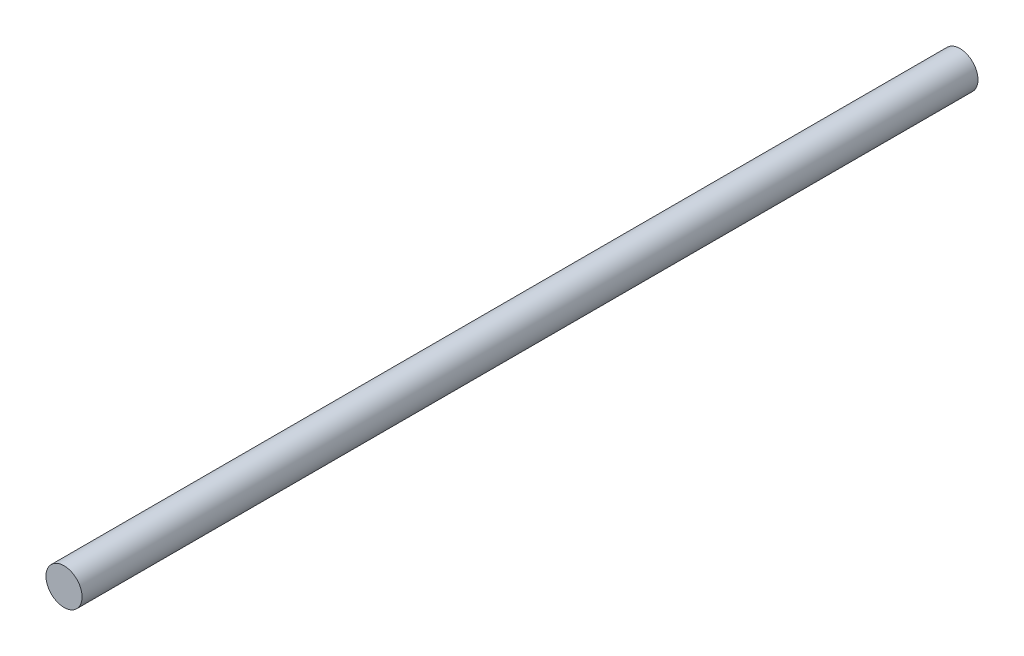
ISO-10303-21;
HEADER;
FILE_DESCRIPTION(('STEP AP214'),'2;1');
FILE_NAME('part.step','',(''),(''),'','','');
FILE_SCHEMA(('AUTOMOTIVE_DESIGN { 1 0 10303 214 1 1 1 1 }'));
ENDSEC;
DATA;
#1=APPLICATION_CONTEXT('core data for automotive mechanical design processes');
#2=APPLICATION_PROTOCOL_DEFINITION('international standard','automotive_design',2000,#1);
#3=PRODUCT_CONTEXT('',#1,'mechanical');
#4=PRODUCT('Part','Part','',(#3));
#5=PRODUCT_RELATED_PRODUCT_CATEGORY('part','',(#4));
#6=PRODUCT_DEFINITION_FORMATION('','',#4);
#7=PRODUCT_DEFINITION_CONTEXT('part definition',#1,'design');
#8=PRODUCT_DEFINITION('design','',#6,#7);
#9=PRODUCT_DEFINITION_SHAPE('','',#8);
#10=(LENGTH_UNIT() NAMED_UNIT(*) SI_UNIT(.MILLI.,.METRE.));
#11=(NAMED_UNIT(*) PLANE_ANGLE_UNIT() SI_UNIT($,.RADIAN.));
#12=(NAMED_UNIT(*) SI_UNIT($,.STERADIAN.) SOLID_ANGLE_UNIT());
#13=UNCERTAINTY_MEASURE_WITH_UNIT(LENGTH_MEASURE(1.E-05),#10,'distance_accuracy_value','');
#14=(GEOMETRIC_REPRESENTATION_CONTEXT(3) GLOBAL_UNCERTAINTY_ASSIGNED_CONTEXT((#13)) GLOBAL_UNIT_ASSIGNED_CONTEXT((#10,
#11,#12)) REPRESENTATION_CONTEXT('',''));
#15=CARTESIAN_POINT('',(0.,0.,0.));
#16=DIRECTION('',(0.,0.,1.));
#17=DIRECTION('',(1.,0.,0.));
#18=AXIS2_PLACEMENT_3D('',#15,#16,#17);
#19=CARTESIAN_POINT('',(0.,0.,157.48));
#20=DIRECTION('',(0.,0.,-1.));
#21=DIRECTION('',(-1.,0.,0.));
#22=AXIS2_PLACEMENT_3D('',#19,#20,#21);
#23=CYLINDRICAL_SURFACE('',#22,3.175);
#24=CARTESIAN_POINT('',(0.,0.,157.48));
#25=DIRECTION('',(0.,0.,1.));
#26=DIRECTION('',(1.,0.,0.));
#27=AXIS2_PLACEMENT_3D('',#24,#25,#26);
#28=CIRCLE('',#27,3.175);
#29=CARTESIAN_POINT('',(3.175,0.,157.48));
#30=VERTEX_POINT('',#29);
#31=EDGE_CURVE('E10',#30,#30,#28,.T.);
#32=ORIENTED_EDGE('',*,*,#31,.F.);
#33=EDGE_LOOP('',(#32));
#34=FACE_BOUND('',#33,.T.);
#35=CARTESIAN_POINT('',(0.,0.,0.));
#36=DIRECTION('',(0.,0.,1.));
#37=DIRECTION('',(1.,0.,0.));
#38=AXIS2_PLACEMENT_3D('',#35,#36,#37);
#39=CIRCLE('',#38,3.175);
#40=CARTESIAN_POINT('',(3.175,0.,0.));
#41=VERTEX_POINT('',#40);
#42=EDGE_CURVE('E40',#41,#41,#39,.T.);
#43=ORIENTED_EDGE('',*,*,#42,.T.);
#44=EDGE_LOOP('',(#43));
#45=FACE_BOUND('',#44,.T.);
#46=ADVANCED_FACE('F37',(#34,#45),#23,.T.);
#47=CARTESIAN_POINT('',(0.,0.,157.48));
#48=DIRECTION('',(0.,0.,1.));
#49=DIRECTION('',(1.,0.,0.));
#50=AXIS2_PLACEMENT_3D('',#47,#48,#49);
#51=PLANE('',#50);
#52=ORIENTED_EDGE('',*,*,#31,.T.);
#53=EDGE_LOOP('',(#52));
#54=FACE_BOUND('',#53,.T.);
#55=ADVANCED_FACE('F52',(#54),#51,.T.);
#56=CARTESIAN_POINT('',(0.,0.,0.));
#57=DIRECTION('',(0.,0.,1.));
#58=DIRECTION('',(1.,0.,0.));
#59=AXIS2_PLACEMENT_3D('',#56,#57,#58);
#60=PLANE('',#59);
#61=ORIENTED_EDGE('',*,*,#42,.F.);
#62=EDGE_LOOP('',(#61));
#63=FACE_BOUND('',#62,.T.);
#64=ADVANCED_FACE('F50',(#63),#60,.F.);
#65=CLOSED_SHELL('',(#46,#55,#64));
#66=MANIFOLD_SOLID_BREP('B2',#65);
#67=ADVANCED_BREP_SHAPE_REPRESENTATION('',(#18,#66),#14);
#68=SHAPE_DEFINITION_REPRESENTATION(#9,#67);
ENDSEC;
END-ISO-10303-21;
